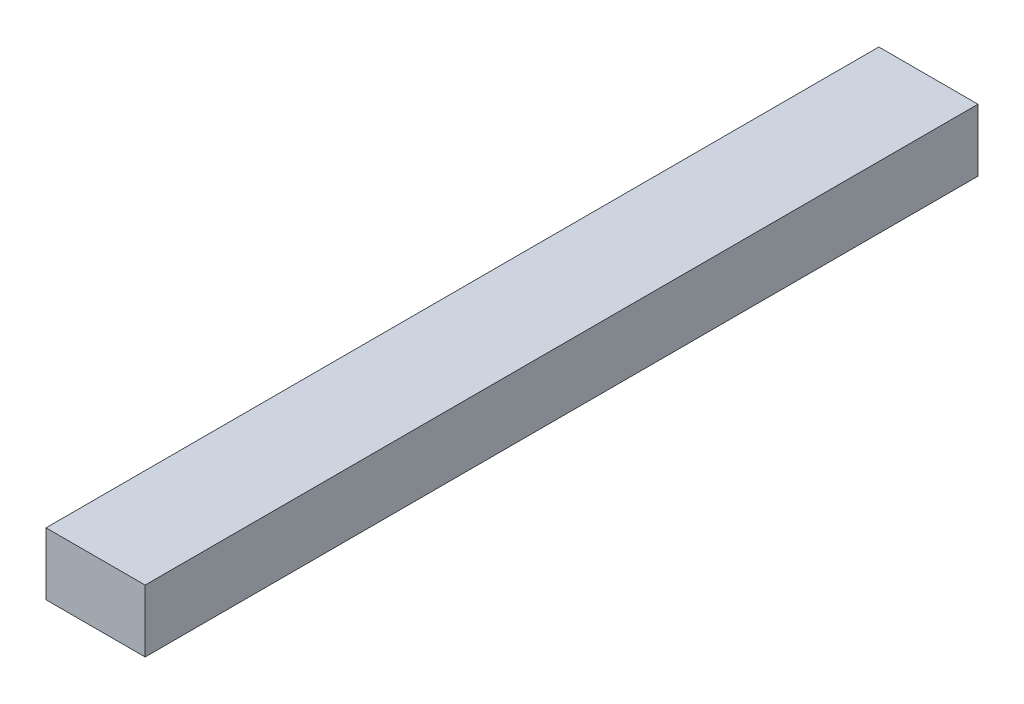
ISO-10303-21;
HEADER;
FILE_DESCRIPTION(('STEP AP214'),'2;1');
FILE_NAME('part.step','',(''),(''),'','','');
FILE_SCHEMA(('AUTOMOTIVE_DESIGN { 1 0 10303 214 1 1 1 1 }'));
ENDSEC;
DATA;
#1=APPLICATION_CONTEXT('core data for automotive mechanical design processes');
#2=APPLICATION_PROTOCOL_DEFINITION('international standard','automotive_design',2000,#1);
#3=PRODUCT_CONTEXT('',#1,'mechanical');
#4=PRODUCT('Part','Part','',(#3));
#5=PRODUCT_RELATED_PRODUCT_CATEGORY('part','',(#4));
#6=PRODUCT_DEFINITION_FORMATION('','',#4);
#7=PRODUCT_DEFINITION_CONTEXT('part definition',#1,'design');
#8=PRODUCT_DEFINITION('design','',#6,#7);
#9=PRODUCT_DEFINITION_SHAPE('','',#8);
#10=(LENGTH_UNIT() NAMED_UNIT(*) SI_UNIT(.MILLI.,.METRE.));
#11=(NAMED_UNIT(*) PLANE_ANGLE_UNIT() SI_UNIT($,.RADIAN.));
#12=(NAMED_UNIT(*) SI_UNIT($,.STERADIAN.) SOLID_ANGLE_UNIT());
#13=UNCERTAINTY_MEASURE_WITH_UNIT(LENGTH_MEASURE(1.E-05),#10,'distance_accuracy_value','');
#14=(GEOMETRIC_REPRESENTATION_CONTEXT(3) GLOBAL_UNCERTAINTY_ASSIGNED_CONTEXT((#13)) GLOBAL_UNIT_ASSIGNED_CONTEXT((#10,
#11,#12)) REPRESENTATION_CONTEXT('',''));
#15=CARTESIAN_POINT('',(0.,0.,0.));
#16=DIRECTION('',(0.,0.,1.));
#17=DIRECTION('',(1.,0.,0.));
#18=AXIS2_PLACEMENT_3D('',#15,#16,#17);
#19=CARTESIAN_POINT('',(-35.,-22.,376.680106434377));
#20=DIRECTION('',(0.,1.,0.));
#21=DIRECTION('',(0.,0.,1.));
#22=AXIS2_PLACEMENT_3D('',#19,#20,#21);
#23=PLANE('',#22);
#24=DIRECTION('',(0.,0.,-1.));
#25=VECTOR('',#24,1.);
#26=CARTESIAN_POINT('',(35.,-22.,376.680106434377));
#27=LINE('',#26,#25);
#28=CARTESIAN_POINT('',(35.,-22.,294.));
#29=VERTEX_POINT('',#28);
#30=CARTESIAN_POINT('',(35.,-22.,-294.));
#31=VERTEX_POINT('',#30);
#32=EDGE_CURVE('E92',#29,#31,#27,.T.);
#33=ORIENTED_EDGE('',*,*,#32,.F.);
#34=DIRECTION('',(-1.,0.,0.));
#35=VECTOR('',#34,1.);
#36=CARTESIAN_POINT('',(-35.,-22.,294.));
#37=LINE('',#36,#35);
#38=CARTESIAN_POINT('',(-35.,-22.,294.));
#39=VERTEX_POINT('',#38);
#40=EDGE_CURVE('E35',#29,#39,#37,.T.);
#41=ORIENTED_EDGE('',*,*,#40,.T.);
#42=DIRECTION('',(0.,0.,-1.));
#43=VECTOR('',#42,1.);
#44=CARTESIAN_POINT('',(-35.,-22.,376.680106434377));
#45=LINE('',#44,#43);
#46=CARTESIAN_POINT('',(-35.,-22.,-294.));
#47=VERTEX_POINT('',#46);
#48=EDGE_CURVE('E79',#39,#47,#45,.T.);
#49=ORIENTED_EDGE('',*,*,#48,.T.);
#50=DIRECTION('',(-1.,0.,0.));
#51=VECTOR('',#50,1.);
#52=CARTESIAN_POINT('',(-35.,-22.,-294.));
#53=LINE('',#52,#51);
#54=EDGE_CURVE('E89',#31,#47,#53,.T.);
#55=ORIENTED_EDGE('',*,*,#54,.F.);
#56=EDGE_LOOP('',(#33,#41,#49,#55));
#57=FACE_BOUND('',#56,.T.);
#58=ADVANCED_FACE('F31',(#57),#23,.F.);
#59=CARTESIAN_POINT('',(-35.,-22.,376.680106434377));
#60=DIRECTION('',(1.,0.,0.));
#61=DIRECTION('',(0.,0.,-1.));
#62=AXIS2_PLACEMENT_3D('',#59,#60,#61);
#63=PLANE('',#62);
#64=ORIENTED_EDGE('',*,*,#48,.F.);
#65=DIRECTION('',(0.,1.,0.));
#66=VECTOR('',#65,1.);
#67=CARTESIAN_POINT('',(-35.,-22.,294.));
#68=LINE('',#67,#66);
#69=CARTESIAN_POINT('',(-35.,22.,294.));
#70=VERTEX_POINT('',#69);
#71=EDGE_CURVE('E75',#39,#70,#68,.T.);
#72=ORIENTED_EDGE('',*,*,#71,.T.);
#73=DIRECTION('',(0.,0.,-1.));
#74=VECTOR('',#73,1.);
#75=CARTESIAN_POINT('',(-35.,22.,376.680106434377));
#76=LINE('',#75,#74);
#77=CARTESIAN_POINT('',(-35.,22.,-294.));
#78=VERTEX_POINT('',#77);
#79=EDGE_CURVE('E70',#70,#78,#76,.T.);
#80=ORIENTED_EDGE('',*,*,#79,.T.);
#81=DIRECTION('',(0.,1.,0.));
#82=VECTOR('',#81,1.);
#83=CARTESIAN_POINT('',(-35.,-22.,-294.));
#84=LINE('',#83,#82);
#85=EDGE_CURVE('E74',#47,#78,#84,.T.);
#86=ORIENTED_EDGE('',*,*,#85,.F.);
#87=EDGE_LOOP('',(#64,#72,#80,#86));
#88=FACE_BOUND('',#87,.T.);
#89=ADVANCED_FACE('F73',(#88),#63,.F.);
#90=CARTESIAN_POINT('',(-35.,22.,376.680106434377));
#91=DIRECTION('',(0.,-1.,0.));
#92=DIRECTION('',(0.,0.,-1.));
#93=AXIS2_PLACEMENT_3D('',#90,#91,#92);
#94=PLANE('',#93);
#95=ORIENTED_EDGE('',*,*,#79,.F.);
#96=DIRECTION('',(1.,0.,0.));
#97=VECTOR('',#96,1.);
#98=CARTESIAN_POINT('',(-35.,22.,294.));
#99=LINE('',#98,#97);
#100=CARTESIAN_POINT('',(35.,22.,294.));
#101=VERTEX_POINT('',#100);
#102=EDGE_CURVE('E40',#70,#101,#99,.T.);
#103=ORIENTED_EDGE('',*,*,#102,.T.);
#104=DIRECTION('',(0.,0.,-1.));
#105=VECTOR('',#104,1.);
#106=CARTESIAN_POINT('',(35.,22.,376.680106434377));
#107=LINE('',#106,#105);
#108=CARTESIAN_POINT('',(35.,22.,-294.));
#109=VERTEX_POINT('',#108);
#110=EDGE_CURVE('E78',#101,#109,#107,.T.);
#111=ORIENTED_EDGE('',*,*,#110,.T.);
#112=DIRECTION('',(1.,0.,0.));
#113=VECTOR('',#112,1.);
#114=CARTESIAN_POINT('',(-35.,22.,-294.));
#115=LINE('',#114,#113);
#116=EDGE_CURVE('E86',#78,#109,#115,.T.);
#117=ORIENTED_EDGE('',*,*,#116,.F.);
#118=EDGE_LOOP('',(#95,#103,#111,#117));
#119=FACE_BOUND('',#118,.T.);
#120=ADVANCED_FACE('F91',(#119),#94,.F.);
#121=CARTESIAN_POINT('',(35.,-22.,376.680106434377));
#122=DIRECTION('',(-1.,0.,0.));
#123=DIRECTION('',(0.,0.,1.));
#124=AXIS2_PLACEMENT_3D('',#121,#122,#123);
#125=PLANE('',#124);
#126=ORIENTED_EDGE('',*,*,#110,.F.);
#127=DIRECTION('',(0.,-1.,0.));
#128=VECTOR('',#127,1.);
#129=CARTESIAN_POINT('',(35.,-22.,294.));
#130=LINE('',#129,#128);
#131=EDGE_CURVE('E11',#101,#29,#130,.T.);
#132=ORIENTED_EDGE('',*,*,#131,.T.);
#133=ORIENTED_EDGE('',*,*,#32,.T.);
#134=DIRECTION('',(0.,-1.,0.));
#135=VECTOR('',#134,1.);
#136=CARTESIAN_POINT('',(35.,-22.,-294.));
#137=LINE('',#136,#135);
#138=EDGE_CURVE('E93',#109,#31,#137,.T.);
#139=ORIENTED_EDGE('',*,*,#138,.F.);
#140=EDGE_LOOP('',(#126,#132,#133,#139));
#141=FACE_BOUND('',#140,.T.);
#142=ADVANCED_FACE('F33',(#141),#125,.F.);
#143=CARTESIAN_POINT('',(105.,-92.0000000000005,294.));
#144=DIRECTION('',(0.,0.,-1.));
#145=DIRECTION('',(-1.,0.,0.));
#146=AXIS2_PLACEMENT_3D('',#143,#144,#145);
#147=PLANE('',#146);
#148=ORIENTED_EDGE('',*,*,#102,.F.);
#149=ORIENTED_EDGE('',*,*,#71,.F.);
#150=ORIENTED_EDGE('',*,*,#40,.F.);
#151=ORIENTED_EDGE('',*,*,#131,.F.);
#152=EDGE_LOOP('',(#148,#149,#150,#151));
#153=FACE_BOUND('',#152,.T.);
#154=ADVANCED_FACE('F104',(#153),#147,.F.);
#155=CARTESIAN_POINT('',(105.,-22.,-294.));
#156=DIRECTION('',(0.,0.,1.));
#157=DIRECTION('',(-1.,0.,0.));
#158=AXIS2_PLACEMENT_3D('',#155,#156,#157);
#159=PLANE('',#158);
#160=ORIENTED_EDGE('',*,*,#138,.T.);
#161=ORIENTED_EDGE('',*,*,#54,.T.);
#162=ORIENTED_EDGE('',*,*,#85,.T.);
#163=ORIENTED_EDGE('',*,*,#116,.T.);
#164=EDGE_LOOP('',(#160,#161,#162,#163));
#165=FACE_BOUND('',#164,.T.);
#166=ADVANCED_FACE('F85',(#165),#159,.F.);
#167=CLOSED_SHELL('',(#58,#89,#120,#142,#154,#166));
#168=MANIFOLD_SOLID_BREP('B2',#167);
#169=ADVANCED_BREP_SHAPE_REPRESENTATION('',(#18,#168),#14);
#170=SHAPE_DEFINITION_REPRESENTATION(#9,#169);
ENDSEC;
END-ISO-10303-21;
